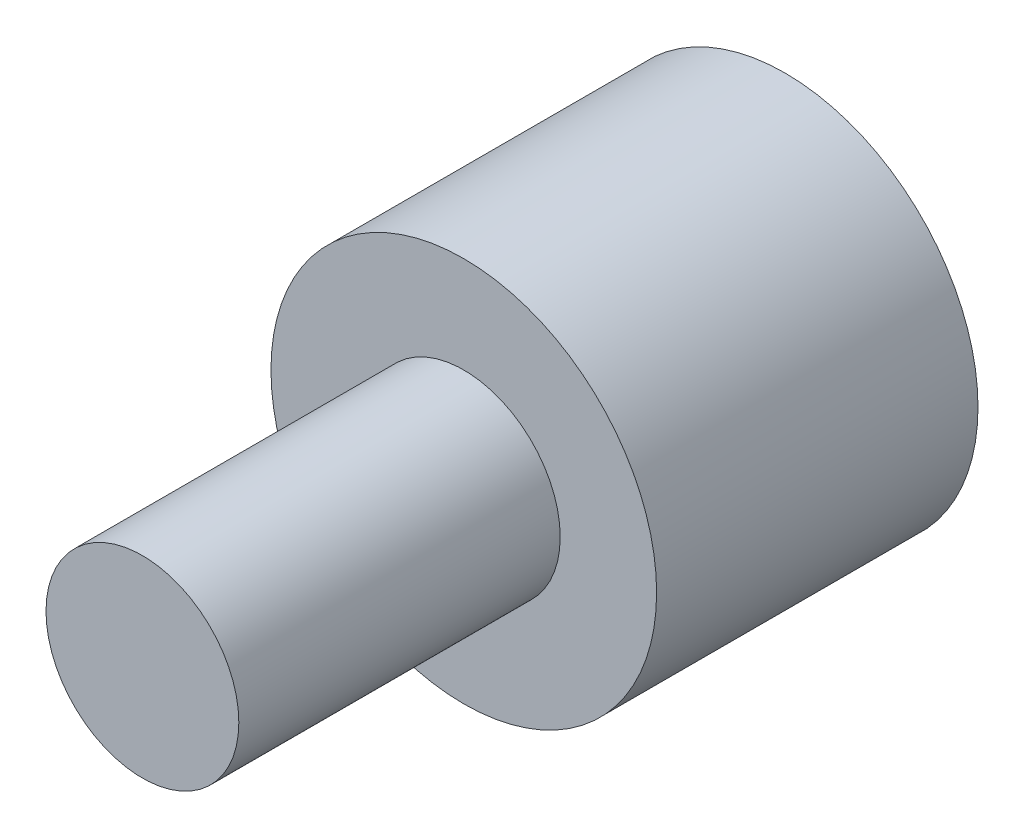
ISO-10303-21;
HEADER;
FILE_DESCRIPTION(('STEP AP214'),'2;1');
FILE_NAME('part.step','',(''),(''),'','','');
FILE_SCHEMA(('AUTOMOTIVE_DESIGN { 1 0 10303 214 1 1 1 1 }'));
ENDSEC;
DATA;
#1=APPLICATION_CONTEXT('core data for automotive mechanical design processes');
#2=APPLICATION_PROTOCOL_DEFINITION('international standard','automotive_design',2000,#1);
#3=PRODUCT_CONTEXT('',#1,'mechanical');
#4=PRODUCT('Part','Part','',(#3));
#5=PRODUCT_RELATED_PRODUCT_CATEGORY('part','',(#4));
#6=PRODUCT_DEFINITION_FORMATION('','',#4);
#7=PRODUCT_DEFINITION_CONTEXT('part definition',#1,'design');
#8=PRODUCT_DEFINITION('design','',#6,#7);
#9=PRODUCT_DEFINITION_SHAPE('','',#8);
#10=(LENGTH_UNIT() NAMED_UNIT(*) SI_UNIT(.MILLI.,.METRE.));
#11=(NAMED_UNIT(*) PLANE_ANGLE_UNIT() SI_UNIT($,.RADIAN.));
#12=(NAMED_UNIT(*) SI_UNIT($,.STERADIAN.) SOLID_ANGLE_UNIT());
#13=UNCERTAINTY_MEASURE_WITH_UNIT(LENGTH_MEASURE(1.E-05),#10,'distance_accuracy_value','');
#14=(GEOMETRIC_REPRESENTATION_CONTEXT(3) GLOBAL_UNCERTAINTY_ASSIGNED_CONTEXT((#13)) GLOBAL_UNIT_ASSIGNED_CONTEXT((#10,
#11,#12)) REPRESENTATION_CONTEXT('',''));
#15=CARTESIAN_POINT('',(0.,0.,0.));
#16=DIRECTION('',(0.,0.,1.));
#17=DIRECTION('',(1.,0.,0.));
#18=AXIS2_PLACEMENT_3D('',#15,#16,#17);
#19=CARTESIAN_POINT('',(0.,0.,20.));
#20=DIRECTION('',(0.,0.,-1.));
#21=DIRECTION('',(-1.,0.,0.));
#22=AXIS2_PLACEMENT_3D('',#19,#20,#21);
#23=CYLINDRICAL_SURFACE('',#22,12.);
#24=CARTESIAN_POINT('',(0.,0.,20.));
#25=DIRECTION('',(0.,0.,1.));
#26=DIRECTION('',(1.,0.,0.));
#27=AXIS2_PLACEMENT_3D('',#24,#25,#26);
#28=CIRCLE('',#27,12.);
#29=CARTESIAN_POINT('',(12.,0.,20.));
#30=VERTEX_POINT('',#29);
#31=EDGE_CURVE('E10',#30,#30,#28,.T.);
#32=ORIENTED_EDGE('',*,*,#31,.F.);
#33=EDGE_LOOP('',(#32));
#34=FACE_BOUND('',#33,.T.);
#35=CARTESIAN_POINT('',(0.,0.,0.));
#36=DIRECTION('',(0.,0.,1.));
#37=DIRECTION('',(1.,0.,0.));
#38=AXIS2_PLACEMENT_3D('',#35,#36,#37);
#39=CIRCLE('',#38,12.);
#40=CARTESIAN_POINT('',(12.,0.,0.));
#41=VERTEX_POINT('',#40);
#42=EDGE_CURVE('E46',#41,#41,#39,.T.);
#43=ORIENTED_EDGE('',*,*,#42,.T.);
#44=EDGE_LOOP('',(#43));
#45=FACE_BOUND('',#44,.T.);
#46=ADVANCED_FACE('F43',(#34,#45),#23,.T.);
#47=CARTESIAN_POINT('',(0.,0.,20.));
#48=DIRECTION('',(0.,0.,1.));
#49=DIRECTION('',(1.,0.,0.));
#50=AXIS2_PLACEMENT_3D('',#47,#48,#49);
#51=PLANE('',#50);
#52=CARTESIAN_POINT('',(0.,0.,20.));
#53=DIRECTION('',(0.,0.,1.));
#54=DIRECTION('',(1.,0.,0.));
#55=AXIS2_PLACEMENT_3D('',#52,#53,#54);
#56=CIRCLE('',#55,6.);
#57=CARTESIAN_POINT('',(6.,0.,20.));
#58=VERTEX_POINT('',#57);
#59=EDGE_CURVE('E55',#58,#58,#56,.F.);
#60=ORIENTED_EDGE('',*,*,#59,.T.);
#61=EDGE_LOOP('',(#60));
#62=FACE_BOUND('',#61,.T.);
#63=ORIENTED_EDGE('',*,*,#31,.T.);
#64=EDGE_LOOP('',(#63));
#65=FACE_BOUND('',#64,.T.);
#66=ADVANCED_FACE('F86',(#62,#65),#51,.T.);
#67=CARTESIAN_POINT('',(0.,0.,0.));
#68=DIRECTION('',(0.,0.,1.));
#69=DIRECTION('',(1.,0.,0.));
#70=AXIS2_PLACEMENT_3D('',#67,#68,#69);
#71=PLANE('',#70);
#72=CARTESIAN_POINT('',(0.,0.,0.));
#73=DIRECTION('',(0.,0.,-1.));
#74=DIRECTION('',(-1.,0.,0.));
#75=AXIS2_PLACEMENT_3D('',#72,#73,#74);
#76=CIRCLE('',#75,5.);
#77=CARTESIAN_POINT('',(-5.,0.,0.));
#78=VERTEX_POINT('',#77);
#79=EDGE_CURVE('E65',#78,#78,#76,.T.);
#80=ORIENTED_EDGE('',*,*,#79,.F.);
#81=EDGE_LOOP('',(#80));
#82=FACE_BOUND('',#81,.T.);
#83=ORIENTED_EDGE('',*,*,#42,.F.);
#84=EDGE_LOOP('',(#83));
#85=FACE_BOUND('',#84,.T.);
#86=ADVANCED_FACE('F82',(#82,#85),#71,.F.);
#87=CARTESIAN_POINT('',(0.,0.,40.));
#88=DIRECTION('',(0.,0.,-1.));
#89=DIRECTION('',(-1.,0.,0.));
#90=AXIS2_PLACEMENT_3D('',#87,#88,#89);
#91=CYLINDRICAL_SURFACE('',#90,6.);
#92=ORIENTED_EDGE('',*,*,#59,.F.);
#93=EDGE_LOOP('',(#92));
#94=FACE_BOUND('',#93,.T.);
#95=CARTESIAN_POINT('',(0.,0.,40.));
#96=DIRECTION('',(0.,0.,1.));
#97=DIRECTION('',(1.,0.,0.));
#98=AXIS2_PLACEMENT_3D('',#95,#96,#97);
#99=CIRCLE('',#98,6.);
#100=CARTESIAN_POINT('',(6.,0.,40.));
#101=VERTEX_POINT('',#100);
#102=EDGE_CURVE('E60',#101,#101,#99,.T.);
#103=ORIENTED_EDGE('',*,*,#102,.F.);
#104=EDGE_LOOP('',(#103));
#105=FACE_BOUND('',#104,.T.);
#106=ADVANCED_FACE('F85',(#94,#105),#91,.T.);
#107=CARTESIAN_POINT('',(0.,0.,40.));
#108=DIRECTION('',(0.,0.,1.));
#109=DIRECTION('',(1.,0.,0.));
#110=AXIS2_PLACEMENT_3D('',#107,#108,#109);
#111=PLANE('',#110);
#112=ORIENTED_EDGE('',*,*,#102,.T.);
#113=EDGE_LOOP('',(#112));
#114=FACE_BOUND('',#113,.T.);
#115=ADVANCED_FACE('F78',(#114),#111,.T.);
#116=CARTESIAN_POINT('',(0.,0.,12.));
#117=DIRECTION('',(0.,0.,-1.));
#118=DIRECTION('',(-1.,0.,0.));
#119=AXIS2_PLACEMENT_3D('',#116,#117,#118);
#120=CYLINDRICAL_SURFACE('',#119,5.);
#121=CARTESIAN_POINT('',(0.,0.,12.));
#122=DIRECTION('',(0.,0.,-1.));
#123=DIRECTION('',(-1.,0.,0.));
#124=AXIS2_PLACEMENT_3D('',#121,#122,#123);
#125=CIRCLE('',#124,5.);
#126=CARTESIAN_POINT('',(-5.,0.,12.));
#127=VERTEX_POINT('',#126);
#128=EDGE_CURVE('E64',#127,#127,#125,.T.);
#129=ORIENTED_EDGE('',*,*,#128,.F.);
#130=EDGE_LOOP('',(#129));
#131=FACE_BOUND('',#130,.T.);
#132=ORIENTED_EDGE('',*,*,#79,.T.);
#133=EDGE_LOOP('',(#132));
#134=FACE_BOUND('',#133,.T.);
#135=ADVANCED_FACE('F75',(#131,#134),#120,.F.);
#136=CARTESIAN_POINT('',(0.,0.,12.));
#137=DIRECTION('',(0.,0.,-1.));
#138=DIRECTION('',(-1.,0.,0.));
#139=AXIS2_PLACEMENT_3D('',#136,#137,#138);
#140=PLANE('',#139);
#141=ORIENTED_EDGE('',*,*,#128,.T.);
#142=EDGE_LOOP('',(#141));
#143=FACE_BOUND('',#142,.T.);
#144=ADVANCED_FACE('F73',(#143),#140,.T.);
#145=CLOSED_SHELL('',(#46,#66,#86,#106,#115,#135,#144));
#146=MANIFOLD_SOLID_BREP('B2',#145);
#147=ADVANCED_BREP_SHAPE_REPRESENTATION('',(#18,#146),#14);
#148=SHAPE_DEFINITION_REPRESENTATION(#9,#147);
ENDSEC;
END-ISO-10303-21;
